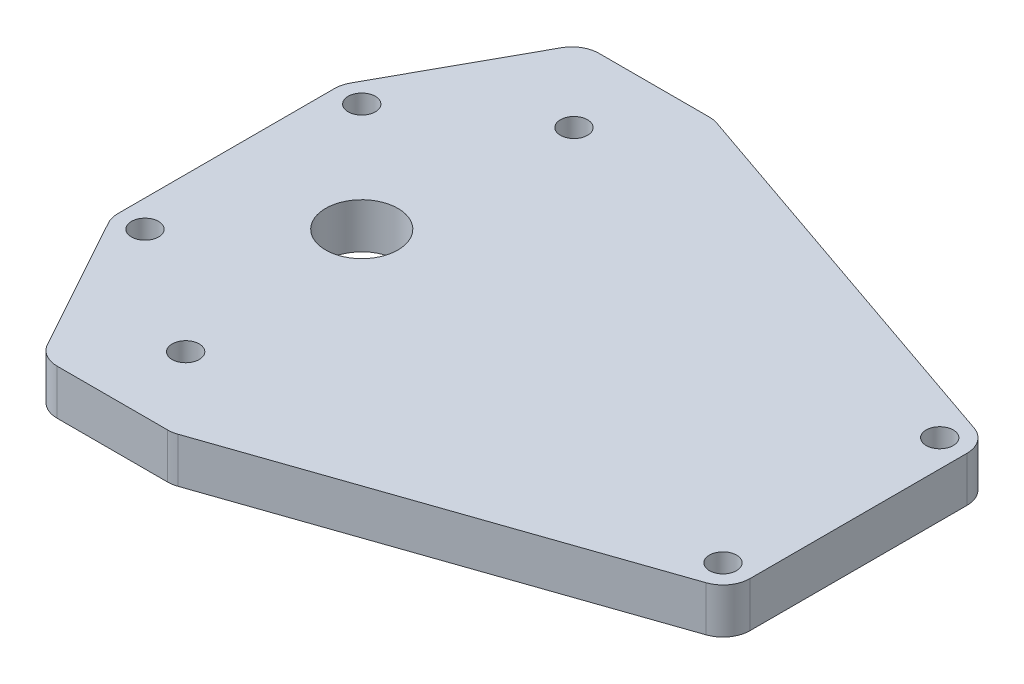
ISO-10303-21;
HEADER;
FILE_DESCRIPTION(('STEP AP214'),'2;1');
FILE_NAME('part.step','',(''),(''),'','','');
FILE_SCHEMA(('AUTOMOTIVE_DESIGN { 1 0 10303 214 1 1 1 1 }'));
ENDSEC;
DATA;
#1=APPLICATION_CONTEXT('core data for automotive mechanical design processes');
#2=APPLICATION_PROTOCOL_DEFINITION('international standard','automotive_design',2000,#1);
#3=PRODUCT_CONTEXT('',#1,'mechanical');
#4=PRODUCT('Part','Part','',(#3));
#5=PRODUCT_RELATED_PRODUCT_CATEGORY('part','',(#4));
#6=PRODUCT_DEFINITION_FORMATION('','',#4);
#7=PRODUCT_DEFINITION_CONTEXT('part definition',#1,'design');
#8=PRODUCT_DEFINITION('design','',#6,#7);
#9=PRODUCT_DEFINITION_SHAPE('','',#8);
#10=(LENGTH_UNIT() NAMED_UNIT(*) SI_UNIT(.MILLI.,.METRE.));
#11=(NAMED_UNIT(*) PLANE_ANGLE_UNIT() SI_UNIT($,.RADIAN.));
#12=(NAMED_UNIT(*) SI_UNIT($,.STERADIAN.) SOLID_ANGLE_UNIT());
#13=UNCERTAINTY_MEASURE_WITH_UNIT(LENGTH_MEASURE(1.E-05),#10,'distance_accuracy_value','');
#14=(GEOMETRIC_REPRESENTATION_CONTEXT(3) GLOBAL_UNCERTAINTY_ASSIGNED_CONTEXT((#13)) GLOBAL_UNIT_ASSIGNED_CONTEXT((#10,
#11,#12)) REPRESENTATION_CONTEXT('',''));
#15=CARTESIAN_POINT('',(0.,0.,0.));
#16=DIRECTION('',(0.,0.,1.));
#17=DIRECTION('',(1.,0.,0.));
#18=AXIS2_PLACEMENT_3D('',#15,#16,#17);
#19=CARTESIAN_POINT('',(134.,0.,24.));
#20=DIRECTION('',(0.,-1.,0.));
#21=DIRECTION('',(0.,0.,-1.));
#22=AXIS2_PLACEMENT_3D('',#19,#20,#21);
#23=PLANE('',#22);
#24=CARTESIAN_POINT('',(6.,0.,24.));
#25=DIRECTION('',(0.,-1.,0.));
#26=DIRECTION('',(0.,0.,-1.));
#27=AXIS2_PLACEMENT_3D('',#24,#25,#26);
#28=CIRCLE('',#27,3.);
#29=CARTESIAN_POINT('',(6.,0.,21.));
#30=VERTEX_POINT('',#29);
#31=EDGE_CURVE('E235',#30,#30,#28,.F.);
#32=ORIENTED_EDGE('',*,*,#31,.T.);
#33=EDGE_LOOP('',(#32));
#34=FACE_BOUND('',#33,.T.);
#35=CARTESIAN_POINT('',(134.,0.,24.));
#36=DIRECTION('',(0.,-1.,0.));
#37=DIRECTION('',(0.,0.,-1.));
#38=AXIS2_PLACEMENT_3D('',#35,#36,#37);
#39=CIRCLE('',#38,3.);
#40=CARTESIAN_POINT('',(134.,0.,21.));
#41=VERTEX_POINT('',#40);
#42=EDGE_CURVE('E238',#41,#41,#39,.F.);
#43=ORIENTED_EDGE('',*,*,#42,.T.);
#44=EDGE_LOOP('',(#43));
#45=FACE_BOUND('',#44,.T.);
#46=CARTESIAN_POINT('',(34.,0.,-43.));
#47=DIRECTION('',(0.,-1.,0.));
#48=DIRECTION('',(0.,0.,-1.));
#49=AXIS2_PLACEMENT_3D('',#46,#47,#48);
#50=CIRCLE('',#49,3.);
#51=CARTESIAN_POINT('',(34.,0.,-46.));
#52=VERTEX_POINT('',#51);
#53=EDGE_CURVE('E241',#52,#52,#50,.F.);
#54=ORIENTED_EDGE('',*,*,#53,.T.);
#55=EDGE_LOOP('',(#54));
#56=FACE_BOUND('',#55,.T.);
#57=CARTESIAN_POINT('',(30.,0.,0.));
#58=DIRECTION('',(0.,-1.,0.));
#59=DIRECTION('',(0.,0.,-1.));
#60=AXIS2_PLACEMENT_3D('',#57,#58,#59);
#61=CIRCLE('',#60,8.);
#62=CARTESIAN_POINT('',(30.,0.,-8.));
#63=VERTEX_POINT('',#62);
#64=EDGE_CURVE('E158',#63,#63,#61,.F.);
#65=ORIENTED_EDGE('',*,*,#64,.T.);
#66=EDGE_LOOP('',(#65));
#67=FACE_BOUND('',#66,.T.);
#68=DIRECTION('',(0.945379188280459,0.,0.325972683466238));
#69=VECTOR('',#68,1.);
#70=CARTESIAN_POINT('',(48.9504608440969,0.,-59.6722751296827));
#71=LINE('',#70,#69);
#72=CARTESIAN_POINT('',(48.9504608440969,0.,-59.6722751296827));
#73=VERTEX_POINT('',#72);
#74=CARTESIAN_POINT('',(135.955836100797,0.,-29.6722751296828));
#75=VERTEX_POINT('',#74);
#76=EDGE_CURVE('E159',#73,#75,#71,.T.);
#77=ORIENTED_EDGE('',*,*,#76,.T.);
#78=CARTESIAN_POINT('',(134.,0.,-24.));
#79=DIRECTION('',(0.,-1.,0.));
#80=DIRECTION('',(0.,0.,-1.));
#81=AXIS2_PLACEMENT_3D('',#78,#79,#80);
#82=CIRCLE('',#81,6.00000000000001);
#83=CARTESIAN_POINT('',(140.,0.,-24.));
#84=VERTEX_POINT('',#83);
#85=EDGE_CURVE('E161',#84,#75,#82,.F.);
#86=ORIENTED_EDGE('',*,*,#85,.F.);
#87=DIRECTION('',(0.,0.,1.));
#88=VECTOR('',#87,1.);
#89=CARTESIAN_POINT('',(140.,0.,0.));
#90=LINE('',#89,#88);
#91=CARTESIAN_POINT('',(140.,0.,24.));
#92=VERTEX_POINT('',#91);
#93=EDGE_CURVE('E135',#84,#92,#90,.T.);
#94=ORIENTED_EDGE('',*,*,#93,.T.);
#95=CARTESIAN_POINT('',(134.,0.,24.));
#96=DIRECTION('',(0.,-1.,0.));
#97=DIRECTION('',(0.,0.,-1.));
#98=AXIS2_PLACEMENT_3D('',#95,#96,#97);
#99=CIRCLE('',#98,6.00000000000001);
#100=CARTESIAN_POINT('',(135.955836100797,0.,29.6722751296828));
#101=VERTEX_POINT('',#100);
#102=EDGE_CURVE('E129',#101,#92,#99,.F.);
#103=ORIENTED_EDGE('',*,*,#102,.F.);
#104=DIRECTION('',(-0.945379188280459,0.,0.325972683466238));
#105=VECTOR('',#104,1.);
#106=CARTESIAN_POINT('',(48.9504608440969,0.,59.6722751296827));
#107=LINE('',#106,#105);
#108=CARTESIAN_POINT('',(48.9504608440969,0.,59.6722751296827));
#109=VERTEX_POINT('',#108);
#110=EDGE_CURVE('E133',#101,#109,#107,.T.);
#111=ORIENTED_EDGE('',*,*,#110,.T.);
#112=CARTESIAN_POINT('',(46.9946247432994,0.,54.));
#113=DIRECTION('',(0.,-1.,0.));
#114=DIRECTION('',(0.,0.,-1.));
#115=AXIS2_PLACEMENT_3D('',#112,#113,#114);
#116=CIRCLE('',#115,6.);
#117=CARTESIAN_POINT('',(46.9946247432994,0.,60.));
#118=VERTEX_POINT('',#117);
#119=EDGE_CURVE('E148',#118,#109,#116,.F.);
#120=ORIENTED_EDGE('',*,*,#119,.F.);
#121=DIRECTION('',(-1.,0.,0.));
#122=VECTOR('',#121,1.);
#123=CARTESIAN_POINT('',(22.5453758585419,0.,60.));
#124=LINE('',#123,#122);
#125=CARTESIAN_POINT('',(22.5453758585419,0.,60.));
#126=VERTEX_POINT('',#125);
#127=EDGE_CURVE('E183',#118,#126,#124,.T.);
#128=ORIENTED_EDGE('',*,*,#127,.T.);
#129=CARTESIAN_POINT('',(22.5453758585419,0.,54.));
#130=DIRECTION('',(0.,-1.,0.));
#131=DIRECTION('',(0.,0.,-1.));
#132=AXIS2_PLACEMENT_3D('',#129,#130,#131);
#133=CIRCLE('',#132,6.);
#134=CARTESIAN_POINT('',(17.2896894020523,0.,56.894436019516));
#135=VERTEX_POINT('',#134);
#136=EDGE_CURVE('E185',#135,#126,#133,.F.);
#137=ORIENTED_EDGE('',*,*,#136,.F.);
#138=DIRECTION('',(-0.482406003252669,0.,-0.875947742748268));
#139=VECTOR('',#138,1.);
#140=CARTESIAN_POINT('',(0.744313543510403,0.,26.8515166974268));
#141=LINE('',#140,#139);
#142=CARTESIAN_POINT('',(0.744313543510399,0.,26.8515166974268));
#143=VERTEX_POINT('',#142);
#144=EDGE_CURVE('E178',#135,#143,#141,.T.);
#145=ORIENTED_EDGE('',*,*,#144,.T.);
#146=CARTESIAN_POINT('',(6.,0.,23.9570806779107));
#147=DIRECTION('',(0.,-1.,0.));
#148=DIRECTION('',(0.,0.,-1.));
#149=AXIS2_PLACEMENT_3D('',#146,#147,#148);
#150=CIRCLE('',#149,6.);
#151=CARTESIAN_POINT('',(0.,0.,23.9570806779107));
#152=VERTEX_POINT('',#151);
#153=EDGE_CURVE('E181',#152,#143,#150,.F.);
#154=ORIENTED_EDGE('',*,*,#153,.F.);
#155=DIRECTION('',(0.,0.,-1.));
#156=VECTOR('',#155,1.);
#157=CARTESIAN_POINT('',(0.,0.,23.9570806779107));
#158=LINE('',#157,#156);
#159=CARTESIAN_POINT('',(0.,0.,-23.9570806779107));
#160=VERTEX_POINT('',#159);
#161=EDGE_CURVE('E173',#152,#160,#158,.T.);
#162=ORIENTED_EDGE('',*,*,#161,.T.);
#163=CARTESIAN_POINT('',(6.,0.,-23.9570806779107));
#164=DIRECTION('',(0.,-1.,0.));
#165=DIRECTION('',(0.,0.,-1.));
#166=AXIS2_PLACEMENT_3D('',#163,#164,#165);
#167=CIRCLE('',#166,6.);
#168=CARTESIAN_POINT('',(0.744313543510398,0.,-26.8515166974268));
#169=VERTEX_POINT('',#168);
#170=EDGE_CURVE('E176',#169,#160,#167,.F.);
#171=ORIENTED_EDGE('',*,*,#170,.F.);
#172=DIRECTION('',(0.482406003252669,0.,-0.875947742748268));
#173=VECTOR('',#172,1.);
#174=CARTESIAN_POINT('',(0.744313543510404,0.,-26.8515166974268));
#175=LINE('',#174,#173);
#176=CARTESIAN_POINT('',(17.2896894020523,0.,-56.894436019516));
#177=VERTEX_POINT('',#176);
#178=EDGE_CURVE('E168',#169,#177,#175,.T.);
#179=ORIENTED_EDGE('',*,*,#178,.T.);
#180=CARTESIAN_POINT('',(22.5453758585419,0.,-54.));
#181=DIRECTION('',(0.,-1.,0.));
#182=DIRECTION('',(0.,0.,-1.));
#183=AXIS2_PLACEMENT_3D('',#180,#181,#182);
#184=CIRCLE('',#183,6.);
#185=CARTESIAN_POINT('',(22.5453758585419,0.,-60.));
#186=VERTEX_POINT('',#185);
#187=EDGE_CURVE('E171',#186,#177,#184,.F.);
#188=ORIENTED_EDGE('',*,*,#187,.F.);
#189=DIRECTION('',(1.,0.,0.));
#190=VECTOR('',#189,1.);
#191=CARTESIAN_POINT('',(22.5453758585419,0.,-60.));
#192=LINE('',#191,#190);
#193=CARTESIAN_POINT('',(46.9946247432994,0.,-60.));
#194=VERTEX_POINT('',#193);
#195=EDGE_CURVE('E163',#186,#194,#192,.T.);
#196=ORIENTED_EDGE('',*,*,#195,.T.);
#197=CARTESIAN_POINT('',(46.9946247432994,0.,-54.));
#198=DIRECTION('',(0.,-1.,0.));
#199=DIRECTION('',(0.,0.,-1.));
#200=AXIS2_PLACEMENT_3D('',#197,#198,#199);
#201=CIRCLE('',#200,6.);
#202=EDGE_CURVE('E166',#73,#194,#201,.F.);
#203=ORIENTED_EDGE('',*,*,#202,.F.);
#204=EDGE_LOOP('',(#77,#86,#94,#103,#111,#120,#128,#137,#145,#154,#162,#171,#179,#188,#196,#203));
#205=FACE_BOUND('',#204,.T.);
#206=CARTESIAN_POINT('',(6.,0.,-24.));
#207=DIRECTION('',(0.,-1.,0.));
#208=DIRECTION('',(0.,0.,-1.));
#209=AXIS2_PLACEMENT_3D('',#206,#207,#208);
#210=CIRCLE('',#209,3.);
#211=CARTESIAN_POINT('',(6.,0.,-27.));
#212=VERTEX_POINT('',#211);
#213=EDGE_CURVE('E141',#212,#212,#210,.F.);
#214=ORIENTED_EDGE('',*,*,#213,.T.);
#215=EDGE_LOOP('',(#214));
#216=FACE_BOUND('',#215,.T.);
#217=CARTESIAN_POINT('',(134.,0.,-24.));
#218=DIRECTION('',(0.,-1.,0.));
#219=DIRECTION('',(0.,0.,-1.));
#220=AXIS2_PLACEMENT_3D('',#217,#218,#219);
#221=CIRCLE('',#220,3.);
#222=CARTESIAN_POINT('',(134.,0.,-27.));
#223=VERTEX_POINT('',#222);
#224=EDGE_CURVE('E260',#223,#223,#221,.F.);
#225=ORIENTED_EDGE('',*,*,#224,.T.);
#226=EDGE_LOOP('',(#225));
#227=FACE_BOUND('',#226,.T.);
#228=CARTESIAN_POINT('',(34.,0.,43.));
#229=DIRECTION('',(0.,-1.,0.));
#230=DIRECTION('',(0.,0.,-1.));
#231=AXIS2_PLACEMENT_3D('',#228,#229,#230);
#232=CIRCLE('',#231,3.);
#233=CARTESIAN_POINT('',(34.,0.,40.));
#234=VERTEX_POINT('',#233);
#235=EDGE_CURVE('E20',#234,#234,#232,.F.);
#236=ORIENTED_EDGE('',*,*,#235,.T.);
#237=EDGE_LOOP('',(#236));
#238=FACE_BOUND('',#237,.T.);
#239=ADVANCED_FACE('F17',(#34,#45,#56,#67,#205,#216,#227,#238),#23,.T.);
#240=CARTESIAN_POINT('',(34.,10.,43.));
#241=DIRECTION('',(0.,-1.,0.));
#242=DIRECTION('',(0.,0.,-1.));
#243=AXIS2_PLACEMENT_3D('',#240,#241,#242);
#244=CYLINDRICAL_SURFACE('',#243,3.);
#245=ORIENTED_EDGE('',*,*,#235,.F.);
#246=EDGE_LOOP('',(#245));
#247=FACE_BOUND('',#246,.T.);
#248=CARTESIAN_POINT('',(34.,10.,43.));
#249=DIRECTION('',(0.,-1.,0.));
#250=DIRECTION('',(0.,0.,-1.));
#251=AXIS2_PLACEMENT_3D('',#248,#249,#250);
#252=CIRCLE('',#251,3.);
#253=CARTESIAN_POINT('',(34.,10.,40.));
#254=VERTEX_POINT('',#253);
#255=EDGE_CURVE('E232',#254,#254,#252,.F.);
#256=ORIENTED_EDGE('',*,*,#255,.T.);
#257=EDGE_LOOP('',(#256));
#258=FACE_BOUND('',#257,.T.);
#259=ADVANCED_FACE('F268',(#247,#258),#244,.F.);
#260=CARTESIAN_POINT('',(134.,10.,-24.));
#261=DIRECTION('',(0.,-1.,0.));
#262=DIRECTION('',(0.,0.,-1.));
#263=AXIS2_PLACEMENT_3D('',#260,#261,#262);
#264=CYLINDRICAL_SURFACE('',#263,3.);
#265=ORIENTED_EDGE('',*,*,#224,.F.);
#266=EDGE_LOOP('',(#265));
#267=FACE_BOUND('',#266,.T.);
#268=CARTESIAN_POINT('',(134.,10.,-24.));
#269=DIRECTION('',(0.,-1.,0.));
#270=DIRECTION('',(0.,0.,-1.));
#271=AXIS2_PLACEMENT_3D('',#268,#269,#270);
#272=CIRCLE('',#271,3.);
#273=CARTESIAN_POINT('',(134.,10.,-27.));
#274=VERTEX_POINT('',#273);
#275=EDGE_CURVE('E229',#274,#274,#272,.F.);
#276=ORIENTED_EDGE('',*,*,#275,.T.);
#277=EDGE_LOOP('',(#276));
#278=FACE_BOUND('',#277,.T.);
#279=ADVANCED_FACE('F271',(#267,#278),#264,.F.);
#280=CARTESIAN_POINT('',(6.,10.,-24.));
#281=DIRECTION('',(0.,-1.,0.));
#282=DIRECTION('',(0.,0.,-1.));
#283=AXIS2_PLACEMENT_3D('',#280,#281,#282);
#284=CYLINDRICAL_SURFACE('',#283,3.);
#285=ORIENTED_EDGE('',*,*,#213,.F.);
#286=EDGE_LOOP('',(#285));
#287=FACE_BOUND('',#286,.T.);
#288=CARTESIAN_POINT('',(6.,10.,-24.));
#289=DIRECTION('',(0.,-1.,0.));
#290=DIRECTION('',(0.,0.,-1.));
#291=AXIS2_PLACEMENT_3D('',#288,#289,#290);
#292=CIRCLE('',#291,3.);
#293=CARTESIAN_POINT('',(6.,10.,-27.));
#294=VERTEX_POINT('',#293);
#295=EDGE_CURVE('E226',#294,#294,#292,.F.);
#296=ORIENTED_EDGE('',*,*,#295,.T.);
#297=EDGE_LOOP('',(#296));
#298=FACE_BOUND('',#297,.T.);
#299=ADVANCED_FACE('F359',(#287,#298),#284,.F.);
#300=CARTESIAN_POINT('',(134.,10.,24.));
#301=DIRECTION('',(0.,-1.,0.));
#302=DIRECTION('',(0.,0.,-1.));
#303=AXIS2_PLACEMENT_3D('',#300,#301,#302);
#304=CYLINDRICAL_SURFACE('',#303,6.00000000000001);
#305=CARTESIAN_POINT('',(134.,10.,24.));
#306=DIRECTION('',(0.,-1.,0.));
#307=DIRECTION('',(0.,0.,-1.));
#308=AXIS2_PLACEMENT_3D('',#305,#306,#307);
#309=CIRCLE('',#308,6.00000000000001);
#310=CARTESIAN_POINT('',(140.,10.,24.));
#311=VERTEX_POINT('',#310);
#312=CARTESIAN_POINT('',(135.955836100797,10.,29.6722751296828));
#313=VERTEX_POINT('',#312);
#314=EDGE_CURVE('E152',#311,#313,#309,.T.);
#315=ORIENTED_EDGE('',*,*,#314,.T.);
#316=DIRECTION('',(0.,1.,0.));
#317=VECTOR('',#316,1.);
#318=CARTESIAN_POINT('',(135.955836100797,10.,29.6722751296828));
#319=LINE('',#318,#317);
#320=EDGE_CURVE('E140',#313,#101,#319,.F.);
#321=ORIENTED_EDGE('',*,*,#320,.T.);
#322=ORIENTED_EDGE('',*,*,#102,.T.);
#323=DIRECTION('',(0.,1.,0.));
#324=VECTOR('',#323,1.);
#325=CARTESIAN_POINT('',(140.,10.,24.));
#326=LINE('',#325,#324);
#327=EDGE_CURVE('E561',#92,#311,#326,.T.);
#328=ORIENTED_EDGE('',*,*,#327,.T.);
#329=EDGE_LOOP('',(#315,#321,#322,#328));
#330=FACE_BOUND('',#329,.T.);
#331=ADVANCED_FACE('F151',(#330),#304,.T.);
#332=CARTESIAN_POINT('',(48.9504608440969,10.,59.6722751296827));
#333=DIRECTION('',(-0.325972683466238,0.,-0.945379188280459));
#334=DIRECTION('',(-0.945379188280459,0.,0.325972683466238));
#335=AXIS2_PLACEMENT_3D('',#332,#333,#334);
#336=PLANE('',#335);
#337=ORIENTED_EDGE('',*,*,#320,.F.);
#338=DIRECTION('',(-0.945379188280459,0.,0.325972683466238));
#339=VECTOR('',#338,1.);
#340=CARTESIAN_POINT('',(135.955836100797,10.,29.6722751296828));
#341=LINE('',#340,#339);
#342=CARTESIAN_POINT('',(48.9504608440969,10.,59.6722751296827));
#343=VERTEX_POINT('',#342);
#344=EDGE_CURVE('E224',#313,#343,#341,.T.);
#345=ORIENTED_EDGE('',*,*,#344,.T.);
#346=DIRECTION('',(0.,-1.,0.));
#347=VECTOR('',#346,1.);
#348=CARTESIAN_POINT('',(48.9504608440969,10.,59.6722751296827));
#349=LINE('',#348,#347);
#350=EDGE_CURVE('E147',#109,#343,#349,.F.);
#351=ORIENTED_EDGE('',*,*,#350,.F.);
#352=ORIENTED_EDGE('',*,*,#110,.F.);
#353=EDGE_LOOP('',(#337,#345,#351,#352));
#354=FACE_BOUND('',#353,.T.);
#355=ADVANCED_FACE('F144',(#354),#336,.F.);
#356=CARTESIAN_POINT('',(46.9946247432994,10.,54.));
#357=DIRECTION('',(0.,-1.,0.));
#358=DIRECTION('',(0.,0.,-1.));
#359=AXIS2_PLACEMENT_3D('',#356,#357,#358);
#360=CYLINDRICAL_SURFACE('',#359,6.);
#361=CARTESIAN_POINT('',(46.9946247432994,10.,54.));
#362=DIRECTION('',(0.,-1.,0.));
#363=DIRECTION('',(0.,0.,-1.));
#364=AXIS2_PLACEMENT_3D('',#361,#362,#363);
#365=CIRCLE('',#364,6.);
#366=CARTESIAN_POINT('',(46.9946247432994,10.,60.));
#367=VERTEX_POINT('',#366);
#368=EDGE_CURVE('E221',#343,#367,#365,.T.);
#369=ORIENTED_EDGE('',*,*,#368,.T.);
#370=DIRECTION('',(0.,1.,0.));
#371=VECTOR('',#370,1.);
#372=CARTESIAN_POINT('',(46.9946247432994,10.,60.));
#373=LINE('',#372,#371);
#374=EDGE_CURVE('E186',#367,#118,#373,.F.);
#375=ORIENTED_EDGE('',*,*,#374,.T.);
#376=ORIENTED_EDGE('',*,*,#119,.T.);
#377=ORIENTED_EDGE('',*,*,#350,.T.);
#378=EDGE_LOOP('',(#369,#375,#376,#377));
#379=FACE_BOUND('',#378,.T.);
#380=ADVANCED_FACE('F350',(#379),#360,.T.);
#381=CARTESIAN_POINT('',(22.5453758585419,10.,60.));
#382=DIRECTION('',(0.,0.,-1.));
#383=DIRECTION('',(-1.,0.,0.));
#384=AXIS2_PLACEMENT_3D('',#381,#382,#383);
#385=PLANE('',#384);
#386=ORIENTED_EDGE('',*,*,#374,.F.);
#387=DIRECTION('',(1.,0.,0.));
#388=VECTOR('',#387,1.);
#389=CARTESIAN_POINT('',(134.,10.,60.));
#390=LINE('',#389,#388);
#391=CARTESIAN_POINT('',(22.5453758585419,10.,60.));
#392=VERTEX_POINT('',#391);
#393=EDGE_CURVE('E220',#367,#392,#390,.F.);
#394=ORIENTED_EDGE('',*,*,#393,.T.);
#395=DIRECTION('',(0.,-1.,0.));
#396=VECTOR('',#395,1.);
#397=CARTESIAN_POINT('',(22.5453758585419,10.,60.));
#398=LINE('',#397,#396);
#399=EDGE_CURVE('E257',#126,#392,#398,.F.);
#400=ORIENTED_EDGE('',*,*,#399,.F.);
#401=ORIENTED_EDGE('',*,*,#127,.F.);
#402=EDGE_LOOP('',(#386,#394,#400,#401));
#403=FACE_BOUND('',#402,.T.);
#404=ADVANCED_FACE('F346',(#403),#385,.F.);
#405=CARTESIAN_POINT('',(22.5453758585419,10.,54.));
#406=DIRECTION('',(0.,-1.,0.));
#407=DIRECTION('',(0.,0.,-1.));
#408=AXIS2_PLACEMENT_3D('',#405,#406,#407);
#409=CYLINDRICAL_SURFACE('',#408,6.);
#410=CARTESIAN_POINT('',(22.5453758585419,10.,54.));
#411=DIRECTION('',(0.,-1.,0.));
#412=DIRECTION('',(0.,0.,-1.));
#413=AXIS2_PLACEMENT_3D('',#410,#411,#412);
#414=CIRCLE('',#413,6.);
#415=CARTESIAN_POINT('',(17.2896894020523,10.,56.894436019516));
#416=VERTEX_POINT('',#415);
#417=EDGE_CURVE('E217',#392,#416,#414,.T.);
#418=ORIENTED_EDGE('',*,*,#417,.T.);
#419=DIRECTION('',(0.,1.,0.));
#420=VECTOR('',#419,1.);
#421=CARTESIAN_POINT('',(17.2896894020523,10.,56.894436019516));
#422=LINE('',#421,#420);
#423=EDGE_CURVE('E182',#416,#135,#422,.F.);
#424=ORIENTED_EDGE('',*,*,#423,.T.);
#425=ORIENTED_EDGE('',*,*,#136,.T.);
#426=ORIENTED_EDGE('',*,*,#399,.T.);
#427=EDGE_LOOP('',(#418,#424,#425,#426));
#428=FACE_BOUND('',#427,.T.);
#429=ADVANCED_FACE('F342',(#428),#409,.T.);
#430=CARTESIAN_POINT('',(0.744313543510403,10.,26.8515166974268));
#431=DIRECTION('',(0.875947742748268,0.,-0.482406003252669));
#432=DIRECTION('',(-0.482406003252669,0.,-0.875947742748268));
#433=AXIS2_PLACEMENT_3D('',#430,#431,#432);
#434=PLANE('',#433);
#435=ORIENTED_EDGE('',*,*,#423,.F.);
#436=DIRECTION('',(-0.48240600325267,0.,-0.875947742748268));
#437=VECTOR('',#436,1.);
#438=CARTESIAN_POINT('',(17.2896894020523,10.,56.894436019516));
#439=LINE('',#438,#437);
#440=CARTESIAN_POINT('',(0.744313543510397,10.,26.8515166974268));
#441=VERTEX_POINT('',#440);
#442=EDGE_CURVE('E216',#416,#441,#439,.T.);
#443=ORIENTED_EDGE('',*,*,#442,.T.);
#444=DIRECTION('',(0.,-1.,0.));
#445=VECTOR('',#444,1.);
#446=CARTESIAN_POINT('',(0.744313543510407,10.,26.8515166974268));
#447=LINE('',#446,#445);
#448=EDGE_CURVE('E255',#143,#441,#447,.F.);
#449=ORIENTED_EDGE('',*,*,#448,.F.);
#450=ORIENTED_EDGE('',*,*,#144,.F.);
#451=EDGE_LOOP('',(#435,#443,#449,#450));
#452=FACE_BOUND('',#451,.T.);
#453=ADVANCED_FACE('F338',(#452),#434,.F.);
#454=CARTESIAN_POINT('',(6.,10.,23.9570806779107));
#455=DIRECTION('',(0.,-1.,0.));
#456=DIRECTION('',(0.,0.,-1.));
#457=AXIS2_PLACEMENT_3D('',#454,#455,#456);
#458=CYLINDRICAL_SURFACE('',#457,6.);
#459=CARTESIAN_POINT('',(6.,10.,23.9570806779107));
#460=DIRECTION('',(0.,-1.,0.));
#461=DIRECTION('',(0.,0.,-1.));
#462=AXIS2_PLACEMENT_3D('',#459,#460,#461);
#463=CIRCLE('',#462,6.);
#464=CARTESIAN_POINT('',(0.,10.,23.9570806779107));
#465=VERTEX_POINT('',#464);
#466=EDGE_CURVE('E213',#441,#465,#463,.T.);
#467=ORIENTED_EDGE('',*,*,#466,.T.);
#468=DIRECTION('',(0.,1.,0.));
#469=VECTOR('',#468,1.);
#470=CARTESIAN_POINT('',(0.,10.,23.9570806779107));
#471=LINE('',#470,#469);
#472=EDGE_CURVE('E177',#465,#152,#471,.F.);
#473=ORIENTED_EDGE('',*,*,#472,.T.);
#474=ORIENTED_EDGE('',*,*,#153,.T.);
#475=ORIENTED_EDGE('',*,*,#448,.T.);
#476=EDGE_LOOP('',(#467,#473,#474,#475));
#477=FACE_BOUND('',#476,.T.);
#478=ADVANCED_FACE('F334',(#477),#458,.T.);
#479=CARTESIAN_POINT('',(0.,10.,23.9570806779107));
#480=DIRECTION('',(1.,0.,0.));
#481=DIRECTION('',(0.,0.,-1.));
#482=AXIS2_PLACEMENT_3D('',#479,#480,#481);
#483=PLANE('',#482);
#484=ORIENTED_EDGE('',*,*,#472,.F.);
#485=DIRECTION('',(0.,0.,-1.));
#486=VECTOR('',#485,1.);
#487=CARTESIAN_POINT('',(0.,10.,24.));
#488=LINE('',#487,#486);
#489=CARTESIAN_POINT('',(0.,10.,-23.9570806779107));
#490=VERTEX_POINT('',#489);
#491=EDGE_CURVE('E212',#465,#490,#488,.T.);
#492=ORIENTED_EDGE('',*,*,#491,.T.);
#493=DIRECTION('',(0.,-1.,0.));
#494=VECTOR('',#493,1.);
#495=CARTESIAN_POINT('',(0.,10.,-23.9570806779107));
#496=LINE('',#495,#494);
#497=EDGE_CURVE('E253',#160,#490,#496,.F.);
#498=ORIENTED_EDGE('',*,*,#497,.F.);
#499=ORIENTED_EDGE('',*,*,#161,.F.);
#500=EDGE_LOOP('',(#484,#492,#498,#499));
#501=FACE_BOUND('',#500,.T.);
#502=ADVANCED_FACE('F330',(#501),#483,.F.);
#503=CARTESIAN_POINT('',(6.,10.,-23.9570806779107));
#504=DIRECTION('',(0.,-1.,0.));
#505=DIRECTION('',(0.,0.,-1.));
#506=AXIS2_PLACEMENT_3D('',#503,#504,#505);
#507=CYLINDRICAL_SURFACE('',#506,6.);
#508=CARTESIAN_POINT('',(6.,10.,-23.9570806779107));
#509=DIRECTION('',(0.,-1.,0.));
#510=DIRECTION('',(0.,0.,-1.));
#511=AXIS2_PLACEMENT_3D('',#508,#509,#510);
#512=CIRCLE('',#511,6.);
#513=CARTESIAN_POINT('',(0.744313543510397,10.,-26.8515166974268));
#514=VERTEX_POINT('',#513);
#515=EDGE_CURVE('E209',#490,#514,#512,.T.);
#516=ORIENTED_EDGE('',*,*,#515,.T.);
#517=DIRECTION('',(0.,1.,0.));
#518=VECTOR('',#517,1.);
#519=CARTESIAN_POINT('',(0.744313543510404,10.,-26.8515166974268));
#520=LINE('',#519,#518);
#521=EDGE_CURVE('E172',#514,#169,#520,.F.);
#522=ORIENTED_EDGE('',*,*,#521,.T.);
#523=ORIENTED_EDGE('',*,*,#170,.T.);
#524=ORIENTED_EDGE('',*,*,#497,.T.);
#525=EDGE_LOOP('',(#516,#522,#523,#524));
#526=FACE_BOUND('',#525,.T.);
#527=ADVANCED_FACE('F326',(#526),#507,.T.);
#528=CARTESIAN_POINT('',(0.744313543510404,10.,-26.8515166974268));
#529=DIRECTION('',(0.875947742748268,0.,0.482406003252669));
#530=DIRECTION('',(0.482406003252669,0.,-0.875947742748268));
#531=AXIS2_PLACEMENT_3D('',#528,#529,#530);
#532=PLANE('',#531);
#533=ORIENTED_EDGE('',*,*,#521,.F.);
#534=DIRECTION('',(0.482406003252669,0.,-0.875947742748268));
#535=VECTOR('',#534,1.);
#536=CARTESIAN_POINT('',(0.7443135435104,10.,-26.8515166974268));
#537=LINE('',#536,#535);
#538=CARTESIAN_POINT('',(17.2896894020523,10.,-56.894436019516));
#539=VERTEX_POINT('',#538);
#540=EDGE_CURVE('E208',#514,#539,#537,.T.);
#541=ORIENTED_EDGE('',*,*,#540,.T.);
#542=DIRECTION('',(0.,-1.,0.));
#543=VECTOR('',#542,1.);
#544=CARTESIAN_POINT('',(17.2896894020523,10.,-56.894436019516));
#545=LINE('',#544,#543);
#546=EDGE_CURVE('E251',#177,#539,#545,.F.);
#547=ORIENTED_EDGE('',*,*,#546,.F.);
#548=ORIENTED_EDGE('',*,*,#178,.F.);
#549=EDGE_LOOP('',(#533,#541,#547,#548));
#550=FACE_BOUND('',#549,.T.);
#551=ADVANCED_FACE('F322',(#550),#532,.F.);
#552=CARTESIAN_POINT('',(22.5453758585419,10.,-54.));
#553=DIRECTION('',(0.,-1.,0.));
#554=DIRECTION('',(0.,0.,-1.));
#555=AXIS2_PLACEMENT_3D('',#552,#553,#554);
#556=CYLINDRICAL_SURFACE('',#555,6.);
#557=CARTESIAN_POINT('',(22.5453758585419,10.,-54.));
#558=DIRECTION('',(0.,-1.,0.));
#559=DIRECTION('',(0.,0.,-1.));
#560=AXIS2_PLACEMENT_3D('',#557,#558,#559);
#561=CIRCLE('',#560,6.);
#562=CARTESIAN_POINT('',(22.5453758585419,10.,-60.));
#563=VERTEX_POINT('',#562);
#564=EDGE_CURVE('E205',#539,#563,#561,.T.);
#565=ORIENTED_EDGE('',*,*,#564,.T.);
#566=DIRECTION('',(0.,1.,0.));
#567=VECTOR('',#566,1.);
#568=CARTESIAN_POINT('',(22.5453758585419,10.,-60.));
#569=LINE('',#568,#567);
#570=EDGE_CURVE('E167',#563,#186,#569,.F.);
#571=ORIENTED_EDGE('',*,*,#570,.T.);
#572=ORIENTED_EDGE('',*,*,#187,.T.);
#573=ORIENTED_EDGE('',*,*,#546,.T.);
#574=EDGE_LOOP('',(#565,#571,#572,#573));
#575=FACE_BOUND('',#574,.T.);
#576=ADVANCED_FACE('F318',(#575),#556,.T.);
#577=CARTESIAN_POINT('',(22.5453758585419,10.,-60.));
#578=DIRECTION('',(0.,0.,1.));
#579=DIRECTION('',(1.,0.,0.));
#580=AXIS2_PLACEMENT_3D('',#577,#578,#579);
#581=PLANE('',#580);
#582=ORIENTED_EDGE('',*,*,#570,.F.);
#583=DIRECTION('',(1.,0.,0.));
#584=VECTOR('',#583,1.);
#585=CARTESIAN_POINT('',(134.,10.,-60.));
#586=LINE('',#585,#584);
#587=CARTESIAN_POINT('',(46.9946247432994,10.,-60.));
#588=VERTEX_POINT('',#587);
#589=EDGE_CURVE('E204',#563,#588,#586,.T.);
#590=ORIENTED_EDGE('',*,*,#589,.T.);
#591=DIRECTION('',(0.,-1.,0.));
#592=VECTOR('',#591,1.);
#593=CARTESIAN_POINT('',(46.9946247432994,10.,-60.));
#594=LINE('',#593,#592);
#595=EDGE_CURVE('E249',#194,#588,#594,.F.);
#596=ORIENTED_EDGE('',*,*,#595,.F.);
#597=ORIENTED_EDGE('',*,*,#195,.F.);
#598=EDGE_LOOP('',(#582,#590,#596,#597));
#599=FACE_BOUND('',#598,.T.);
#600=ADVANCED_FACE('F314',(#599),#581,.F.);
#601=CARTESIAN_POINT('',(46.9946247432994,10.,-54.));
#602=DIRECTION('',(0.,-1.,0.));
#603=DIRECTION('',(0.,0.,-1.));
#604=AXIS2_PLACEMENT_3D('',#601,#602,#603);
#605=CYLINDRICAL_SURFACE('',#604,6.);
#606=CARTESIAN_POINT('',(46.9946247432994,10.,-54.));
#607=DIRECTION('',(0.,-1.,0.));
#608=DIRECTION('',(0.,0.,-1.));
#609=AXIS2_PLACEMENT_3D('',#606,#607,#608);
#610=CIRCLE('',#609,6.);
#611=CARTESIAN_POINT('',(48.9504608440969,10.,-59.6722751296828));
#612=VERTEX_POINT('',#611);
#613=EDGE_CURVE('E201',#588,#612,#610,.T.);
#614=ORIENTED_EDGE('',*,*,#613,.T.);
#615=DIRECTION('',(0.,1.,0.));
#616=VECTOR('',#615,1.);
#617=CARTESIAN_POINT('',(48.9504608440969,10.,-59.6722751296827));
#618=LINE('',#617,#616);
#619=EDGE_CURVE('E162',#612,#73,#618,.F.);
#620=ORIENTED_EDGE('',*,*,#619,.T.);
#621=ORIENTED_EDGE('',*,*,#202,.T.);
#622=ORIENTED_EDGE('',*,*,#595,.T.);
#623=EDGE_LOOP('',(#614,#620,#621,#622));
#624=FACE_BOUND('',#623,.T.);
#625=ADVANCED_FACE('F310',(#624),#605,.T.);
#626=CARTESIAN_POINT('',(48.9504608440969,10.,-59.6722751296827));
#627=DIRECTION('',(-0.325972683466238,0.,0.945379188280459));
#628=DIRECTION('',(0.945379188280459,0.,0.325972683466238));
#629=AXIS2_PLACEMENT_3D('',#626,#627,#628);
#630=PLANE('',#629);
#631=ORIENTED_EDGE('',*,*,#619,.F.);
#632=DIRECTION('',(0.945379188280459,0.,0.325972683466239));
#633=VECTOR('',#632,1.);
#634=CARTESIAN_POINT('',(48.9504608440969,10.,-59.6722751296828));
#635=LINE('',#634,#633);
#636=CARTESIAN_POINT('',(135.955836100797,10.,-29.6722751296828));
#637=VERTEX_POINT('',#636);
#638=EDGE_CURVE('E200',#612,#637,#635,.T.);
#639=ORIENTED_EDGE('',*,*,#638,.T.);
#640=DIRECTION('',(0.,-1.,0.));
#641=VECTOR('',#640,1.);
#642=CARTESIAN_POINT('',(135.955836100797,10.,-29.6722751296828));
#643=LINE('',#642,#641);
#644=EDGE_CURVE('E247',#75,#637,#643,.F.);
#645=ORIENTED_EDGE('',*,*,#644,.F.);
#646=ORIENTED_EDGE('',*,*,#76,.F.);
#647=EDGE_LOOP('',(#631,#639,#645,#646));
#648=FACE_BOUND('',#647,.T.);
#649=ADVANCED_FACE('F306',(#648),#630,.F.);
#650=CARTESIAN_POINT('',(134.,10.,-24.));
#651=DIRECTION('',(0.,-1.,0.));
#652=DIRECTION('',(0.,0.,-1.));
#653=AXIS2_PLACEMENT_3D('',#650,#651,#652);
#654=CYLINDRICAL_SURFACE('',#653,6.00000000000001);
#655=CARTESIAN_POINT('',(134.,10.,-24.));
#656=DIRECTION('',(0.,-1.,0.));
#657=DIRECTION('',(0.,0.,-1.));
#658=AXIS2_PLACEMENT_3D('',#655,#656,#657);
#659=CIRCLE('',#658,6.00000000000001);
#660=CARTESIAN_POINT('',(140.,10.,-24.));
#661=VERTEX_POINT('',#660);
#662=EDGE_CURVE('E197',#637,#661,#659,.T.);
#663=ORIENTED_EDGE('',*,*,#662,.T.);
#664=DIRECTION('',(0.,1.,0.));
#665=VECTOR('',#664,1.);
#666=CARTESIAN_POINT('',(140.,10.,-24.));
#667=LINE('',#666,#665);
#668=EDGE_CURVE('E35',#661,#84,#667,.F.);
#669=ORIENTED_EDGE('',*,*,#668,.T.);
#670=ORIENTED_EDGE('',*,*,#85,.T.);
#671=ORIENTED_EDGE('',*,*,#644,.T.);
#672=EDGE_LOOP('',(#663,#669,#670,#671));
#673=FACE_BOUND('',#672,.T.);
#674=ADVANCED_FACE('F303',(#673),#654,.T.);
#675=CARTESIAN_POINT('',(140.,10.,0.));
#676=DIRECTION('',(-1.,0.,0.));
#677=DIRECTION('',(0.,0.,1.));
#678=AXIS2_PLACEMENT_3D('',#675,#676,#677);
#679=PLANE('',#678);
#680=ORIENTED_EDGE('',*,*,#668,.F.);
#681=DIRECTION('',(0.,0.,-1.));
#682=VECTOR('',#681,1.);
#683=CARTESIAN_POINT('',(140.,10.,24.));
#684=LINE('',#683,#682);
#685=EDGE_CURVE('E196',#661,#311,#684,.F.);
#686=ORIENTED_EDGE('',*,*,#685,.T.);
#687=ORIENTED_EDGE('',*,*,#327,.F.);
#688=ORIENTED_EDGE('',*,*,#93,.F.);
#689=EDGE_LOOP('',(#680,#686,#687,#688));
#690=FACE_BOUND('',#689,.T.);
#691=ADVANCED_FACE('F299',(#690),#679,.F.);
#692=CARTESIAN_POINT('',(30.,10.,0.));
#693=DIRECTION('',(0.,-1.,0.));
#694=DIRECTION('',(0.,0.,-1.));
#695=AXIS2_PLACEMENT_3D('',#692,#693,#694);
#696=CYLINDRICAL_SURFACE('',#695,8.);
#697=ORIENTED_EDGE('',*,*,#64,.F.);
#698=EDGE_LOOP('',(#697));
#699=FACE_BOUND('',#698,.T.);
#700=CARTESIAN_POINT('',(30.,10.,0.));
#701=DIRECTION('',(0.,-1.,0.));
#702=DIRECTION('',(0.,0.,-1.));
#703=AXIS2_PLACEMENT_3D('',#700,#701,#702);
#704=CIRCLE('',#703,8.);
#705=CARTESIAN_POINT('',(30.,10.,-8.));
#706=VERTEX_POINT('',#705);
#707=EDGE_CURVE('E193',#706,#706,#704,.F.);
#708=ORIENTED_EDGE('',*,*,#707,.T.);
#709=EDGE_LOOP('',(#708));
#710=FACE_BOUND('',#709,.T.);
#711=ADVANCED_FACE('F295',(#699,#710),#696,.F.);
#712=CARTESIAN_POINT('',(34.,10.,-43.));
#713=DIRECTION('',(0.,-1.,0.));
#714=DIRECTION('',(0.,0.,-1.));
#715=AXIS2_PLACEMENT_3D('',#712,#713,#714);
#716=CYLINDRICAL_SURFACE('',#715,3.);
#717=ORIENTED_EDGE('',*,*,#53,.F.);
#718=EDGE_LOOP('',(#717));
#719=FACE_BOUND('',#718,.T.);
#720=CARTESIAN_POINT('',(34.,10.,-43.));
#721=DIRECTION('',(0.,-1.,0.));
#722=DIRECTION('',(0.,0.,-1.));
#723=AXIS2_PLACEMENT_3D('',#720,#721,#722);
#724=CIRCLE('',#723,3.);
#725=CARTESIAN_POINT('',(34.,10.,-46.));
#726=VERTEX_POINT('',#725);
#727=EDGE_CURVE('E190',#726,#726,#724,.F.);
#728=ORIENTED_EDGE('',*,*,#727,.T.);
#729=EDGE_LOOP('',(#728));
#730=FACE_BOUND('',#729,.T.);
#731=ADVANCED_FACE('F291',(#719,#730),#716,.F.);
#732=CARTESIAN_POINT('',(134.,10.,24.));
#733=DIRECTION('',(0.,-1.,0.));
#734=DIRECTION('',(0.,0.,-1.));
#735=AXIS2_PLACEMENT_3D('',#732,#733,#734);
#736=CYLINDRICAL_SURFACE('',#735,3.);
#737=ORIENTED_EDGE('',*,*,#42,.F.);
#738=EDGE_LOOP('',(#737));
#739=FACE_BOUND('',#738,.T.);
#740=CARTESIAN_POINT('',(134.,10.,24.));
#741=DIRECTION('',(0.,-1.,0.));
#742=DIRECTION('',(0.,0.,-1.));
#743=AXIS2_PLACEMENT_3D('',#740,#741,#742);
#744=CIRCLE('',#743,3.);
#745=CARTESIAN_POINT('',(134.,10.,21.));
#746=VERTEX_POINT('',#745);
#747=EDGE_CURVE('E26',#746,#746,#744,.F.);
#748=ORIENTED_EDGE('',*,*,#747,.T.);
#749=EDGE_LOOP('',(#748));
#750=FACE_BOUND('',#749,.T.);
#751=ADVANCED_FACE('F283',(#739,#750),#736,.F.);
#752=CARTESIAN_POINT('',(6.,10.,24.));
#753=DIRECTION('',(0.,-1.,0.));
#754=DIRECTION('',(0.,0.,-1.));
#755=AXIS2_PLACEMENT_3D('',#752,#753,#754);
#756=CYLINDRICAL_SURFACE('',#755,3.);
#757=ORIENTED_EDGE('',*,*,#31,.F.);
#758=EDGE_LOOP('',(#757));
#759=FACE_BOUND('',#758,.T.);
#760=CARTESIAN_POINT('',(6.,10.,24.));
#761=DIRECTION('',(0.,-1.,0.));
#762=DIRECTION('',(0.,0.,-1.));
#763=AXIS2_PLACEMENT_3D('',#760,#761,#762);
#764=CIRCLE('',#763,3.);
#765=CARTESIAN_POINT('',(6.,10.,21.));
#766=VERTEX_POINT('',#765);
#767=EDGE_CURVE('E11',#766,#766,#764,.F.);
#768=ORIENTED_EDGE('',*,*,#767,.T.);
#769=EDGE_LOOP('',(#768));
#770=FACE_BOUND('',#769,.T.);
#771=ADVANCED_FACE('F276',(#759,#770),#756,.F.);
#772=CARTESIAN_POINT('',(134.,10.,24.));
#773=DIRECTION('',(0.,-1.,0.));
#774=DIRECTION('',(0.,0.,-1.));
#775=AXIS2_PLACEMENT_3D('',#772,#773,#774);
#776=PLANE('',#775);
#777=ORIENTED_EDGE('',*,*,#767,.F.);
#778=EDGE_LOOP('',(#777));
#779=FACE_BOUND('',#778,.T.);
#780=ORIENTED_EDGE('',*,*,#747,.F.);
#781=EDGE_LOOP('',(#780));
#782=FACE_BOUND('',#781,.T.);
#783=ORIENTED_EDGE('',*,*,#727,.F.);
#784=EDGE_LOOP('',(#783));
#785=FACE_BOUND('',#784,.T.);
#786=ORIENTED_EDGE('',*,*,#707,.F.);
#787=EDGE_LOOP('',(#786));
#788=FACE_BOUND('',#787,.T.);
#789=ORIENTED_EDGE('',*,*,#662,.F.);
#790=ORIENTED_EDGE('',*,*,#638,.F.);
#791=ORIENTED_EDGE('',*,*,#613,.F.);
#792=ORIENTED_EDGE('',*,*,#589,.F.);
#793=ORIENTED_EDGE('',*,*,#564,.F.);
#794=ORIENTED_EDGE('',*,*,#540,.F.);
#795=ORIENTED_EDGE('',*,*,#515,.F.);
#796=ORIENTED_EDGE('',*,*,#491,.F.);
#797=ORIENTED_EDGE('',*,*,#466,.F.);
#798=ORIENTED_EDGE('',*,*,#442,.F.);
#799=ORIENTED_EDGE('',*,*,#417,.F.);
#800=ORIENTED_EDGE('',*,*,#393,.F.);
#801=ORIENTED_EDGE('',*,*,#368,.F.);
#802=ORIENTED_EDGE('',*,*,#344,.F.);
#803=ORIENTED_EDGE('',*,*,#314,.F.);
#804=ORIENTED_EDGE('',*,*,#685,.F.);
#805=EDGE_LOOP('',(#789,#790,#791,#792,#793,#794,#795,#796,#797,#798,#799,#800,#801,#802,#803,#804));
#806=FACE_BOUND('',#805,.T.);
#807=ORIENTED_EDGE('',*,*,#295,.F.);
#808=EDGE_LOOP('',(#807));
#809=FACE_BOUND('',#808,.T.);
#810=ORIENTED_EDGE('',*,*,#275,.F.);
#811=EDGE_LOOP('',(#810));
#812=FACE_BOUND('',#811,.T.);
#813=ORIENTED_EDGE('',*,*,#255,.F.);
#814=EDGE_LOOP('',(#813));
#815=FACE_BOUND('',#814,.T.);
#816=ADVANCED_FACE('F274',(#779,#782,#785,#788,#806,#809,#812,#815),#776,.F.);
#817=CLOSED_SHELL('',(#239,#259,#279,#299,#331,#355,#380,#404,#429,#453,#478,#502,#527,#551,
#576,#600,#625,#649,#674,#691,#711,#731,#751,#771,#816));
#818=MANIFOLD_SOLID_BREP('B1',#817);
#819=ADVANCED_BREP_SHAPE_REPRESENTATION('',(#18,#818),#14);
#820=SHAPE_DEFINITION_REPRESENTATION(#9,#819);
ENDSEC;
END-ISO-10303-21;
